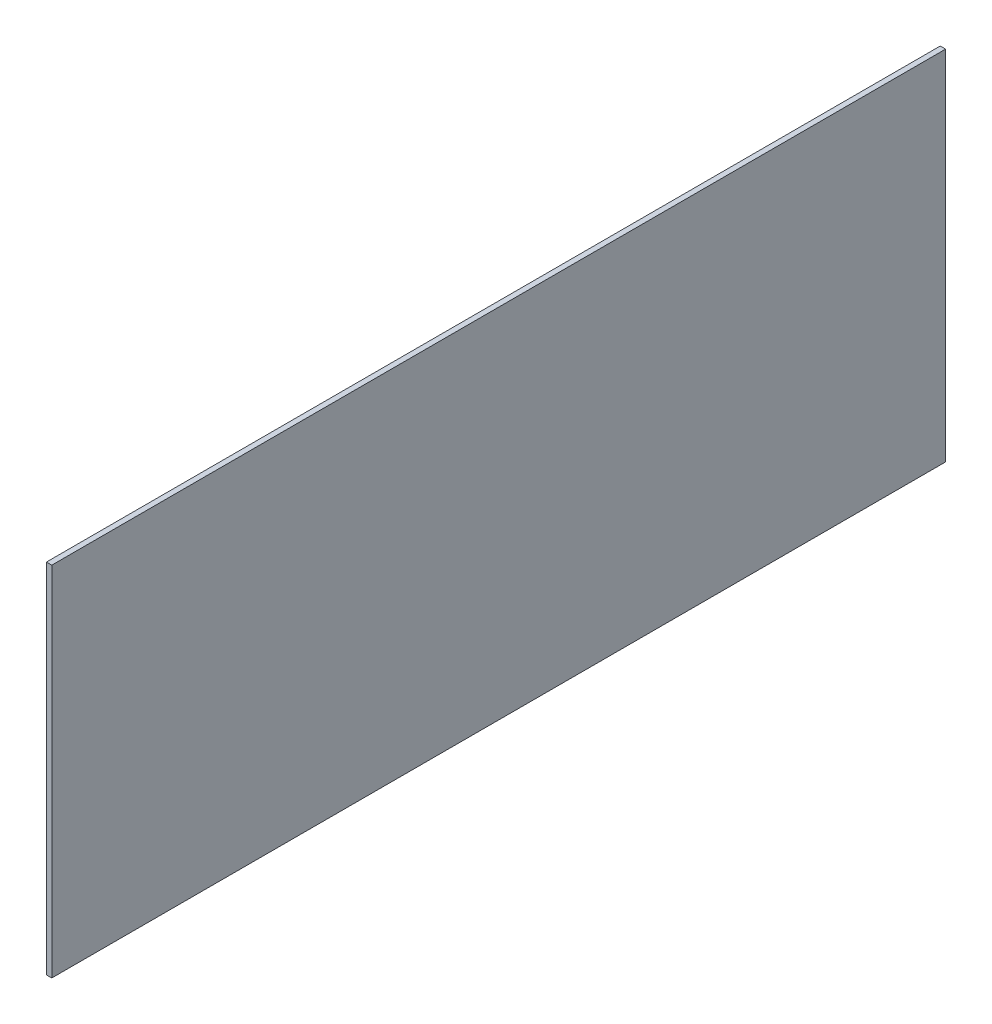
ISO-10303-21;
HEADER;
FILE_DESCRIPTION(('STEP AP214'),'2;1');
FILE_NAME('part.step','',(''),(''),'','','');
FILE_SCHEMA(('AUTOMOTIVE_DESIGN { 1 0 10303 214 1 1 1 1 }'));
ENDSEC;
DATA;
#1=APPLICATION_CONTEXT('core data for automotive mechanical design processes');
#2=APPLICATION_PROTOCOL_DEFINITION('international standard','automotive_design',2000,#1);
#3=PRODUCT_CONTEXT('',#1,'mechanical');
#4=PRODUCT('Part','Part','',(#3));
#5=PRODUCT_RELATED_PRODUCT_CATEGORY('part','',(#4));
#6=PRODUCT_DEFINITION_FORMATION('','',#4);
#7=PRODUCT_DEFINITION_CONTEXT('part definition',#1,'design');
#8=PRODUCT_DEFINITION('design','',#6,#7);
#9=PRODUCT_DEFINITION_SHAPE('','',#8);
#10=(LENGTH_UNIT() NAMED_UNIT(*) SI_UNIT(.MILLI.,.METRE.));
#11=(NAMED_UNIT(*) PLANE_ANGLE_UNIT() SI_UNIT($,.RADIAN.));
#12=(NAMED_UNIT(*) SI_UNIT($,.STERADIAN.) SOLID_ANGLE_UNIT());
#13=UNCERTAINTY_MEASURE_WITH_UNIT(LENGTH_MEASURE(1.E-05),#10,'distance_accuracy_value','');
#14=(GEOMETRIC_REPRESENTATION_CONTEXT(3) GLOBAL_UNCERTAINTY_ASSIGNED_CONTEXT((#13)) GLOBAL_UNIT_ASSIGNED_CONTEXT((#10,
#11,#12)) REPRESENTATION_CONTEXT('',''));
#15=CARTESIAN_POINT('',(0.,0.,0.));
#16=DIRECTION('',(0.,0.,1.));
#17=DIRECTION('',(1.,0.,0.));
#18=AXIS2_PLACEMENT_3D('',#15,#16,#17);
#19=CARTESIAN_POINT('',(1.2,0.,200.));
#20=DIRECTION('',(-1.,0.,0.));
#21=DIRECTION('',(0.,0.,1.));
#22=AXIS2_PLACEMENT_3D('',#19,#20,#21);
#23=PLANE('',#22);
#24=DIRECTION('',(0.,1.,0.));
#25=VECTOR('',#24,1.);
#26=CARTESIAN_POINT('',(1.2,0.,0.));
#27=LINE('',#26,#25);
#28=CARTESIAN_POINT('',(1.2,0.,0.));
#29=VERTEX_POINT('',#28);
#30=CARTESIAN_POINT('',(1.2,80.,0.));
#31=VERTEX_POINT('',#30);
#32=EDGE_CURVE('E106',#29,#31,#27,.T.);
#33=ORIENTED_EDGE('',*,*,#32,.T.);
#34=DIRECTION('',(0.,0.,-1.));
#35=VECTOR('',#34,1.);
#36=CARTESIAN_POINT('',(1.2,80.,200.));
#37=LINE('',#36,#35);
#38=CARTESIAN_POINT('',(1.2,80.,200.));
#39=VERTEX_POINT('',#38);
#40=EDGE_CURVE('E11',#39,#31,#37,.T.);
#41=ORIENTED_EDGE('',*,*,#40,.F.);
#42=DIRECTION('',(0.,1.,0.));
#43=VECTOR('',#42,1.);
#44=CARTESIAN_POINT('',(1.2,0.,200.));
#45=LINE('',#44,#43);
#46=CARTESIAN_POINT('',(1.2,0.,200.));
#47=VERTEX_POINT('',#46);
#48=EDGE_CURVE('E83',#47,#39,#45,.T.);
#49=ORIENTED_EDGE('',*,*,#48,.F.);
#50=DIRECTION('',(0.,0.,-1.));
#51=VECTOR('',#50,1.);
#52=CARTESIAN_POINT('',(1.2,0.,200.));
#53=LINE('',#52,#51);
#54=EDGE_CURVE('E59',#47,#29,#53,.T.);
#55=ORIENTED_EDGE('',*,*,#54,.T.);
#56=EDGE_LOOP('',(#33,#41,#49,#55));
#57=FACE_BOUND('',#56,.T.);
#58=ADVANCED_FACE('F43',(#57),#23,.F.);
#59=CARTESIAN_POINT('',(0.,80.,200.));
#60=DIRECTION('',(0.,1.,0.));
#61=DIRECTION('',(0.,0.,1.));
#62=AXIS2_PLACEMENT_3D('',#59,#60,#61);
#63=PLANE('',#62);
#64=DIRECTION('',(1.,0.,0.));
#65=VECTOR('',#64,1.);
#66=CARTESIAN_POINT('',(0.,80.,0.));
#67=LINE('',#66,#65);
#68=CARTESIAN_POINT('',(0.,80.,0.));
#69=VERTEX_POINT('',#68);
#70=EDGE_CURVE('E92',#69,#31,#67,.T.);
#71=ORIENTED_EDGE('',*,*,#70,.F.);
#72=DIRECTION('',(0.,0.,-1.));
#73=VECTOR('',#72,1.);
#74=CARTESIAN_POINT('',(0.,80.,200.));
#75=LINE('',#74,#73);
#76=CARTESIAN_POINT('',(0.,80.,200.));
#77=VERTEX_POINT('',#76);
#78=EDGE_CURVE('E51',#77,#69,#75,.T.);
#79=ORIENTED_EDGE('',*,*,#78,.F.);
#80=DIRECTION('',(1.,0.,0.));
#81=VECTOR('',#80,1.);
#82=CARTESIAN_POINT('',(0.,80.,200.));
#83=LINE('',#82,#81);
#84=EDGE_CURVE('E90',#77,#39,#83,.T.);
#85=ORIENTED_EDGE('',*,*,#84,.T.);
#86=ORIENTED_EDGE('',*,*,#40,.T.);
#87=EDGE_LOOP('',(#71,#79,#85,#86));
#88=FACE_BOUND('',#87,.T.);
#89=ADVANCED_FACE('F89',(#88),#63,.T.);
#90=CARTESIAN_POINT('',(0.,0.,200.));
#91=DIRECTION('',(-1.,0.,0.));
#92=DIRECTION('',(0.,0.,1.));
#93=AXIS2_PLACEMENT_3D('',#90,#91,#92);
#94=PLANE('',#93);
#95=DIRECTION('',(0.,1.,0.));
#96=VECTOR('',#95,1.);
#97=CARTESIAN_POINT('',(0.,0.,0.));
#98=LINE('',#97,#96);
#99=CARTESIAN_POINT('',(0.,0.,0.));
#100=VERTEX_POINT('',#99);
#101=EDGE_CURVE('E109',#100,#69,#98,.T.);
#102=ORIENTED_EDGE('',*,*,#101,.F.);
#103=DIRECTION('',(0.,0.,-1.));
#104=VECTOR('',#103,1.);
#105=CARTESIAN_POINT('',(0.,0.,200.));
#106=LINE('',#105,#104);
#107=CARTESIAN_POINT('',(0.,0.,200.));
#108=VERTEX_POINT('',#107);
#109=EDGE_CURVE('E72',#108,#100,#106,.T.);
#110=ORIENTED_EDGE('',*,*,#109,.F.);
#111=DIRECTION('',(0.,1.,0.));
#112=VECTOR('',#111,1.);
#113=CARTESIAN_POINT('',(0.,0.,200.));
#114=LINE('',#113,#112);
#115=EDGE_CURVE('E98',#108,#77,#114,.T.);
#116=ORIENTED_EDGE('',*,*,#115,.T.);
#117=ORIENTED_EDGE('',*,*,#78,.T.);
#118=EDGE_LOOP('',(#102,#110,#116,#117));
#119=FACE_BOUND('',#118,.T.);
#120=ADVANCED_FACE('F100',(#119),#94,.T.);
#121=CARTESIAN_POINT('',(1.2,0.,200.));
#122=DIRECTION('',(0.,-1.,0.));
#123=DIRECTION('',(0.,0.,-1.));
#124=AXIS2_PLACEMENT_3D('',#121,#122,#123);
#125=PLANE('',#124);
#126=DIRECTION('',(-1.,0.,0.));
#127=VECTOR('',#126,1.);
#128=CARTESIAN_POINT('',(1.2,0.,0.));
#129=LINE('',#128,#127);
#130=EDGE_CURVE('E111',#29,#100,#129,.T.);
#131=ORIENTED_EDGE('',*,*,#130,.F.);
#132=ORIENTED_EDGE('',*,*,#54,.F.);
#133=DIRECTION('',(-1.,0.,0.));
#134=VECTOR('',#133,1.);
#135=CARTESIAN_POINT('',(1.2,0.,200.));
#136=LINE('',#135,#134);
#137=EDGE_CURVE('E101',#47,#108,#136,.T.);
#138=ORIENTED_EDGE('',*,*,#137,.T.);
#139=ORIENTED_EDGE('',*,*,#109,.T.);
#140=EDGE_LOOP('',(#131,#132,#138,#139));
#141=FACE_BOUND('',#140,.T.);
#142=ADVANCED_FACE('F117',(#141),#125,.T.);
#143=CARTESIAN_POINT('',(0.,0.,200.));
#144=DIRECTION('',(0.,0.,-1.));
#145=DIRECTION('',(-1.,0.,0.));
#146=AXIS2_PLACEMENT_3D('',#143,#144,#145);
#147=PLANE('',#146);
#148=ORIENTED_EDGE('',*,*,#48,.T.);
#149=ORIENTED_EDGE('',*,*,#84,.F.);
#150=ORIENTED_EDGE('',*,*,#115,.F.);
#151=ORIENTED_EDGE('',*,*,#137,.F.);
#152=EDGE_LOOP('',(#148,#149,#150,#151));
#153=FACE_BOUND('',#152,.T.);
#154=ADVANCED_FACE('F97',(#153),#147,.F.);
#155=CARTESIAN_POINT('',(0.,0.,0.));
#156=DIRECTION('',(0.,0.,-1.));
#157=DIRECTION('',(-1.,0.,0.));
#158=AXIS2_PLACEMENT_3D('',#155,#156,#157);
#159=PLANE('',#158);
#160=ORIENTED_EDGE('',*,*,#32,.F.);
#161=ORIENTED_EDGE('',*,*,#130,.T.);
#162=ORIENTED_EDGE('',*,*,#101,.T.);
#163=ORIENTED_EDGE('',*,*,#70,.T.);
#164=EDGE_LOOP('',(#160,#161,#162,#163));
#165=FACE_BOUND('',#164,.T.);
#166=ADVANCED_FACE('F116',(#165),#159,.T.);
#167=CLOSED_SHELL('',(#58,#89,#120,#142,#154,#166));
#168=MANIFOLD_SOLID_BREP('B2',#167);
#169=ADVANCED_BREP_SHAPE_REPRESENTATION('',(#18,#168),#14);
#170=SHAPE_DEFINITION_REPRESENTATION(#9,#169);
ENDSEC;
END-ISO-10303-21;
